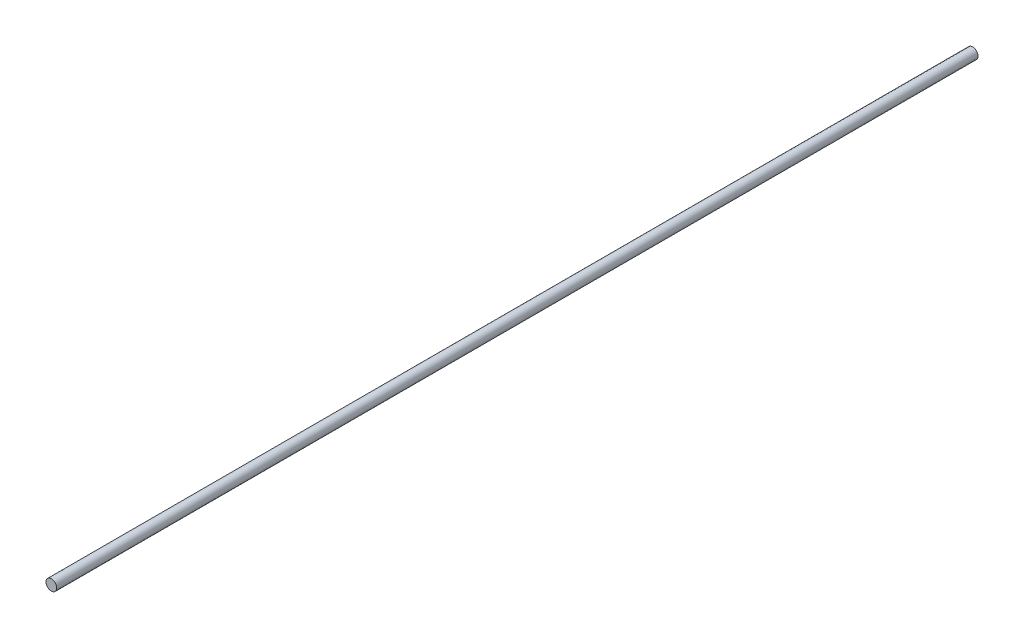
ISO-10303-21;
HEADER;
FILE_DESCRIPTION(('STEP AP214'),'2;1');
FILE_NAME('part.step','',(''),(''),'','','');
FILE_SCHEMA(('AUTOMOTIVE_DESIGN { 1 0 10303 214 1 1 1 1 }'));
ENDSEC;
DATA;
#1=APPLICATION_CONTEXT('core data for automotive mechanical design processes');
#2=APPLICATION_PROTOCOL_DEFINITION('international standard','automotive_design',2000,#1);
#3=PRODUCT_CONTEXT('',#1,'mechanical');
#4=PRODUCT('Part','Part','',(#3));
#5=PRODUCT_RELATED_PRODUCT_CATEGORY('part','',(#4));
#6=PRODUCT_DEFINITION_FORMATION('','',#4);
#7=PRODUCT_DEFINITION_CONTEXT('part definition',#1,'design');
#8=PRODUCT_DEFINITION('design','',#6,#7);
#9=PRODUCT_DEFINITION_SHAPE('','',#8);
#10=(LENGTH_UNIT() NAMED_UNIT(*) SI_UNIT(.MILLI.,.METRE.));
#11=(NAMED_UNIT(*) PLANE_ANGLE_UNIT() SI_UNIT($,.RADIAN.));
#12=(NAMED_UNIT(*) SI_UNIT($,.STERADIAN.) SOLID_ANGLE_UNIT());
#13=UNCERTAINTY_MEASURE_WITH_UNIT(LENGTH_MEASURE(1.E-05),#10,'distance_accuracy_value','');
#14=(GEOMETRIC_REPRESENTATION_CONTEXT(3) GLOBAL_UNCERTAINTY_ASSIGNED_CONTEXT((#13)) GLOBAL_UNIT_ASSIGNED_CONTEXT((#10,
#11,#12)) REPRESENTATION_CONTEXT('',''));
#15=CARTESIAN_POINT('',(0.,0.,0.));
#16=DIRECTION('',(0.,0.,1.));
#17=DIRECTION('',(1.,0.,0.));
#18=AXIS2_PLACEMENT_3D('',#15,#16,#17);
#19=CARTESIAN_POINT('',(0.,0.,850.));
#20=DIRECTION('',(0.,0.,-1.));
#21=DIRECTION('',(-1.,0.,0.));
#22=AXIS2_PLACEMENT_3D('',#19,#20,#21);
#23=CYLINDRICAL_SURFACE('',#22,5.);
#24=CARTESIAN_POINT('',(0.,0.,860.));
#25=DIRECTION('',(0.,0.,1.));
#26=DIRECTION('',(1.,0.,0.));
#27=AXIS2_PLACEMENT_3D('',#24,#25,#26);
#28=CIRCLE('',#27,5.);
#29=CARTESIAN_POINT('',(5.,0.,860.));
#30=VERTEX_POINT('',#29);
#31=EDGE_CURVE('E11',#30,#30,#28,.T.);
#32=ORIENTED_EDGE('',*,*,#31,.F.);
#33=EDGE_LOOP('',(#32));
#34=FACE_BOUND('',#33,.T.);
#35=CARTESIAN_POINT('',(0.,0.,0.));
#36=DIRECTION('',(0.,0.,1.));
#37=DIRECTION('',(1.,0.,0.));
#38=AXIS2_PLACEMENT_3D('',#35,#36,#37);
#39=CIRCLE('',#38,5.);
#40=CARTESIAN_POINT('',(5.,0.,0.));
#41=VERTEX_POINT('',#40);
#42=EDGE_CURVE('E42',#41,#41,#39,.T.);
#43=ORIENTED_EDGE('',*,*,#42,.T.);
#44=EDGE_LOOP('',(#43));
#45=FACE_BOUND('',#44,.T.);
#46=ADVANCED_FACE('F35',(#34,#45),#23,.T.);
#47=CARTESIAN_POINT('',(0.,0.,860.));
#48=DIRECTION('',(0.,0.,1.));
#49=DIRECTION('',(1.,0.,0.));
#50=AXIS2_PLACEMENT_3D('',#47,#48,#49);
#51=PLANE('',#50);
#52=ORIENTED_EDGE('',*,*,#31,.T.);
#53=EDGE_LOOP('',(#52));
#54=FACE_BOUND('',#53,.T.);
#55=ADVANCED_FACE('F37',(#54),#51,.T.);
#56=CARTESIAN_POINT('',(0.,0.,0.));
#57=DIRECTION('',(0.,0.,1.));
#58=DIRECTION('',(1.,0.,0.));
#59=AXIS2_PLACEMENT_3D('',#56,#57,#58);
#60=PLANE('',#59);
#61=ORIENTED_EDGE('',*,*,#42,.F.);
#62=EDGE_LOOP('',(#61));
#63=FACE_BOUND('',#62,.T.);
#64=ADVANCED_FACE('F49',(#63),#60,.F.);
#65=CLOSED_SHELL('',(#46,#55,#64));
#66=MANIFOLD_SOLID_BREP('B2',#65);
#67=ADVANCED_BREP_SHAPE_REPRESENTATION('',(#18,#66),#14);
#68=SHAPE_DEFINITION_REPRESENTATION(#9,#67);
ENDSEC;
END-ISO-10303-21;
